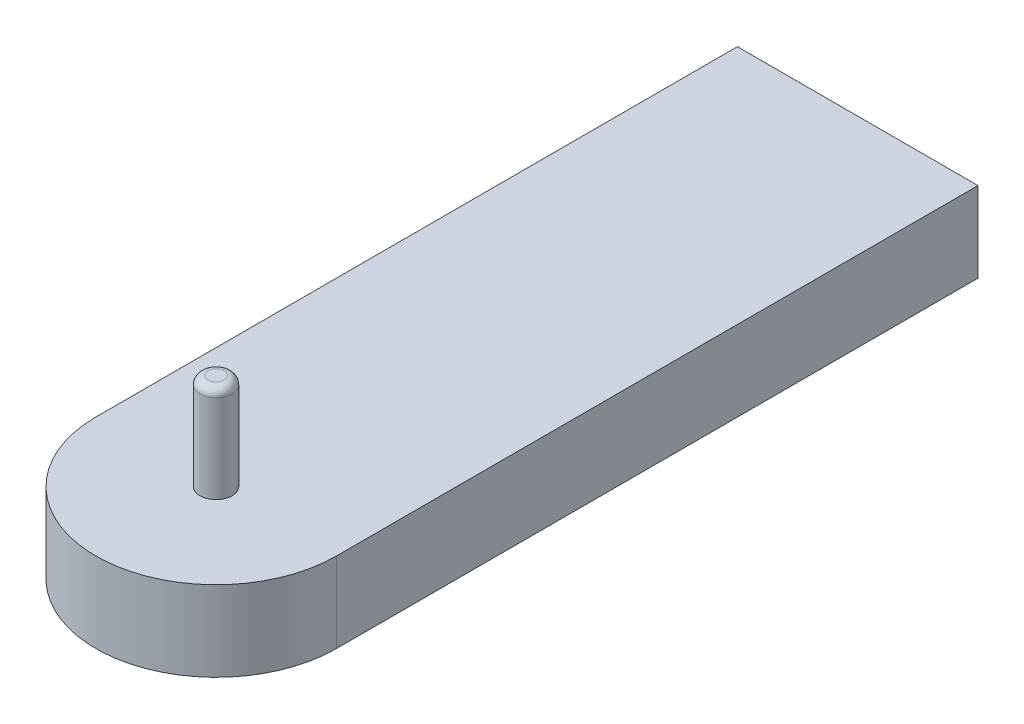
ISO-10303-21;
HEADER;
FILE_DESCRIPTION(('STEP AP214'),'2;1');
FILE_NAME('part.step','',(''),(''),'','','');
FILE_SCHEMA(('AUTOMOTIVE_DESIGN { 1 0 10303 214 1 1 1 1 }'));
ENDSEC;
DATA;
#1=APPLICATION_CONTEXT('core data for automotive mechanical design processes');
#2=APPLICATION_PROTOCOL_DEFINITION('international standard','automotive_design',2000,#1);
#3=PRODUCT_CONTEXT('',#1,'mechanical');
#4=PRODUCT('Part','Part','',(#3));
#5=PRODUCT_RELATED_PRODUCT_CATEGORY('part','',(#4));
#6=PRODUCT_DEFINITION_FORMATION('','',#4);
#7=PRODUCT_DEFINITION_CONTEXT('part definition',#1,'design');
#8=PRODUCT_DEFINITION('design','',#6,#7);
#9=PRODUCT_DEFINITION_SHAPE('','',#8);
#10=(LENGTH_UNIT() NAMED_UNIT(*) SI_UNIT(.MILLI.,.METRE.));
#11=(NAMED_UNIT(*) PLANE_ANGLE_UNIT() SI_UNIT($,.RADIAN.));
#12=(NAMED_UNIT(*) SI_UNIT($,.STERADIAN.) SOLID_ANGLE_UNIT());
#13=UNCERTAINTY_MEASURE_WITH_UNIT(LENGTH_MEASURE(1.E-05),#10,'distance_accuracy_value','');
#14=(GEOMETRIC_REPRESENTATION_CONTEXT(3) GLOBAL_UNCERTAINTY_ASSIGNED_CONTEXT((#13)) GLOBAL_UNIT_ASSIGNED_CONTEXT((#10,
#11,#12)) REPRESENTATION_CONTEXT('',''));
#15=CARTESIAN_POINT('',(0.,0.,0.));
#16=DIRECTION('',(0.,0.,1.));
#17=DIRECTION('',(1.,0.,0.));
#18=AXIS2_PLACEMENT_3D('',#15,#16,#17);
#19=CARTESIAN_POINT('',(75.0000000000001,50.,400.));
#20=DIRECTION('',(0.,1.,0.));
#21=DIRECTION('',(0.,0.,1.));
#22=AXIS2_PLACEMENT_3D('',#19,#20,#21);
#23=PLANE('',#22);
#24=DIRECTION('',(0.,0.,1.));
#25=VECTOR('',#24,1.);
#26=CARTESIAN_POINT('',(0.,50.,0.));
#27=LINE('',#26,#25);
#28=CARTESIAN_POINT('',(0.,50.,0.));
#29=VERTEX_POINT('',#28);
#30=CARTESIAN_POINT('',(0.,50.,400.));
#31=VERTEX_POINT('',#30);
#32=EDGE_CURVE('E89',#29,#31,#27,.T.);
#33=ORIENTED_EDGE('',*,*,#32,.T.);
#34=CARTESIAN_POINT('',(75.0000000000001,50.,400.));
#35=DIRECTION('',(0.,1.,0.));
#36=DIRECTION('',(0.,0.,1.));
#37=AXIS2_PLACEMENT_3D('',#34,#35,#36);
#38=CIRCLE('',#37,75.);
#39=CARTESIAN_POINT('',(150.,50.,400.));
#40=VERTEX_POINT('',#39);
#41=EDGE_CURVE('E84',#31,#40,#38,.T.);
#42=ORIENTED_EDGE('',*,*,#41,.T.);
#43=DIRECTION('',(0.,0.,-1.));
#44=VECTOR('',#43,1.);
#45=CARTESIAN_POINT('',(150.,50.,0.));
#46=LINE('',#45,#44);
#47=CARTESIAN_POINT('',(150.,50.,0.));
#48=VERTEX_POINT('',#47);
#49=EDGE_CURVE('E87',#40,#48,#46,.T.);
#50=ORIENTED_EDGE('',*,*,#49,.T.);
#51=DIRECTION('',(-1.,0.,0.));
#52=VECTOR('',#51,1.);
#53=CARTESIAN_POINT('',(0.,50.,0.));
#54=LINE('',#53,#52);
#55=EDGE_CURVE('E53',#48,#29,#54,.T.);
#56=ORIENTED_EDGE('',*,*,#55,.T.);
#57=EDGE_LOOP('',(#33,#42,#50,#56));
#58=FACE_BOUND('',#57,.T.);
#59=CARTESIAN_POINT('',(75.0000000000001,50.,400.));
#60=DIRECTION('',(0.,1.,0.));
#61=DIRECTION('',(0.,0.,1.));
#62=AXIS2_PLACEMENT_3D('',#59,#60,#61);
#63=CIRCLE('',#62,10.);
#64=CARTESIAN_POINT('',(75.0000000000001,50.,410.));
#65=VERTEX_POINT('',#64);
#66=EDGE_CURVE('E107',#65,#65,#63,.T.);
#67=ORIENTED_EDGE('',*,*,#66,.F.);
#68=EDGE_LOOP('',(#67));
#69=FACE_BOUND('',#68,.T.);
#70=ADVANCED_FACE('F36',(#58,#69),#23,.T.);
#71=CARTESIAN_POINT('',(0.,50.,0.));
#72=DIRECTION('',(1.,0.,0.));
#73=DIRECTION('',(0.,0.,-1.));
#74=AXIS2_PLACEMENT_3D('',#71,#72,#73);
#75=PLANE('',#74);
#76=DIRECTION('',(0.,0.,1.));
#77=VECTOR('',#76,1.);
#78=CARTESIAN_POINT('',(0.,0.,0.));
#79=LINE('',#78,#77);
#80=CARTESIAN_POINT('',(0.,0.,0.));
#81=VERTEX_POINT('',#80);
#82=CARTESIAN_POINT('',(0.,0.,400.));
#83=VERTEX_POINT('',#82);
#84=EDGE_CURVE('E104',#81,#83,#79,.T.);
#85=ORIENTED_EDGE('',*,*,#84,.T.);
#86=DIRECTION('',(0.,-1.,0.));
#87=VECTOR('',#86,1.);
#88=CARTESIAN_POINT('',(0.,50.,400.));
#89=LINE('',#88,#87);
#90=EDGE_CURVE('E95',#31,#83,#89,.T.);
#91=ORIENTED_EDGE('',*,*,#90,.F.);
#92=ORIENTED_EDGE('',*,*,#32,.F.);
#93=DIRECTION('',(0.,-1.,0.));
#94=VECTOR('',#93,1.);
#95=CARTESIAN_POINT('',(0.,50.,0.));
#96=LINE('',#95,#94);
#97=EDGE_CURVE('E100',#29,#81,#96,.T.);
#98=ORIENTED_EDGE('',*,*,#97,.T.);
#99=EDGE_LOOP('',(#85,#91,#92,#98));
#100=FACE_BOUND('',#99,.T.);
#101=ADVANCED_FACE('F127',(#100),#75,.F.);
#102=CARTESIAN_POINT('',(75.0000000000001,50.,400.));
#103=DIRECTION('',(0.,-1.,0.));
#104=DIRECTION('',(0.,0.,-1.));
#105=AXIS2_PLACEMENT_3D('',#102,#103,#104);
#106=CYLINDRICAL_SURFACE('',#105,75.);
#107=CARTESIAN_POINT('',(75.0000000000001,0.,400.));
#108=DIRECTION('',(0.,1.,0.));
#109=DIRECTION('',(0.,0.,1.));
#110=AXIS2_PLACEMENT_3D('',#107,#108,#109);
#111=CIRCLE('',#110,75.);
#112=CARTESIAN_POINT('',(150.,0.,400.));
#113=VERTEX_POINT('',#112);
#114=EDGE_CURVE('E94',#83,#113,#111,.T.);
#115=ORIENTED_EDGE('',*,*,#114,.T.);
#116=DIRECTION('',(0.,-1.,0.));
#117=VECTOR('',#116,1.);
#118=CARTESIAN_POINT('',(150.,50.,400.));
#119=LINE('',#118,#117);
#120=EDGE_CURVE('E92',#40,#113,#119,.T.);
#121=ORIENTED_EDGE('',*,*,#120,.F.);
#122=ORIENTED_EDGE('',*,*,#41,.F.);
#123=ORIENTED_EDGE('',*,*,#90,.T.);
#124=EDGE_LOOP('',(#115,#121,#122,#123));
#125=FACE_BOUND('',#124,.T.);
#126=ADVANCED_FACE('F93',(#125),#106,.T.);
#127=CARTESIAN_POINT('',(150.,50.,0.));
#128=DIRECTION('',(-1.,0.,0.));
#129=DIRECTION('',(0.,0.,1.));
#130=AXIS2_PLACEMENT_3D('',#127,#128,#129);
#131=PLANE('',#130);
#132=DIRECTION('',(0.,0.,-1.));
#133=VECTOR('',#132,1.);
#134=CARTESIAN_POINT('',(150.,0.,0.));
#135=LINE('',#134,#133);
#136=CARTESIAN_POINT('',(150.,0.,0.));
#137=VERTEX_POINT('',#136);
#138=EDGE_CURVE('E70',#113,#137,#135,.T.);
#139=ORIENTED_EDGE('',*,*,#138,.T.);
#140=DIRECTION('',(0.,-1.,0.));
#141=VECTOR('',#140,1.);
#142=CARTESIAN_POINT('',(150.,50.,0.));
#143=LINE('',#142,#141);
#144=EDGE_CURVE('E96',#48,#137,#143,.T.);
#145=ORIENTED_EDGE('',*,*,#144,.F.);
#146=ORIENTED_EDGE('',*,*,#49,.F.);
#147=ORIENTED_EDGE('',*,*,#120,.T.);
#148=EDGE_LOOP('',(#139,#145,#146,#147));
#149=FACE_BOUND('',#148,.T.);
#150=ADVANCED_FACE('F98',(#149),#131,.F.);
#151=CARTESIAN_POINT('',(0.,50.,0.));
#152=DIRECTION('',(0.,0.,1.));
#153=DIRECTION('',(1.,0.,0.));
#154=AXIS2_PLACEMENT_3D('',#151,#152,#153);
#155=PLANE('',#154);
#156=DIRECTION('',(-1.,0.,0.));
#157=VECTOR('',#156,1.);
#158=CARTESIAN_POINT('',(0.,0.,0.));
#159=LINE('',#158,#157);
#160=EDGE_CURVE('E76',#137,#81,#159,.T.);
#161=ORIENTED_EDGE('',*,*,#160,.T.);
#162=ORIENTED_EDGE('',*,*,#97,.F.);
#163=ORIENTED_EDGE('',*,*,#55,.F.);
#164=ORIENTED_EDGE('',*,*,#144,.T.);
#165=EDGE_LOOP('',(#161,#162,#163,#164));
#166=FACE_BOUND('',#165,.T.);
#167=ADVANCED_FACE('F138',(#166),#155,.F.);
#168=CARTESIAN_POINT('',(75.0000000000001,0.,400.));
#169=DIRECTION('',(0.,1.,0.));
#170=DIRECTION('',(0.,0.,1.));
#171=AXIS2_PLACEMENT_3D('',#168,#169,#170);
#172=PLANE('',#171);
#173=ORIENTED_EDGE('',*,*,#84,.F.);
#174=ORIENTED_EDGE('',*,*,#160,.F.);
#175=ORIENTED_EDGE('',*,*,#138,.F.);
#176=ORIENTED_EDGE('',*,*,#114,.F.);
#177=EDGE_LOOP('',(#173,#174,#175,#176));
#178=FACE_BOUND('',#177,.T.);
#179=ADVANCED_FACE('F135',(#178),#172,.F.);
#180=CARTESIAN_POINT('',(75.0000000000001,110.,400.));
#181=DIRECTION('',(0.,-1.,0.));
#182=DIRECTION('',(0.,0.,-1.));
#183=AXIS2_PLACEMENT_3D('',#180,#181,#182);
#184=CYLINDRICAL_SURFACE('',#183,10.);
#185=CARTESIAN_POINT('',(75.0000000000001,105.,400.));
#186=DIRECTION('',(0.,1.,0.));
#187=DIRECTION('',(0.,0.,1.));
#188=AXIS2_PLACEMENT_3D('',#185,#186,#187);
#189=CIRCLE('',#188,10.);
#190=CARTESIAN_POINT('',(75.0000000000001,105.,410.));
#191=VERTEX_POINT('',#190);
#192=EDGE_CURVE('E11',#191,#191,#189,.F.);
#193=ORIENTED_EDGE('',*,*,#192,.T.);
#194=EDGE_LOOP('',(#193));
#195=FACE_BOUND('',#194,.T.);
#196=ORIENTED_EDGE('',*,*,#66,.T.);
#197=EDGE_LOOP('',(#196));
#198=FACE_BOUND('',#197,.T.);
#199=ADVANCED_FACE('F123',(#195,#198),#184,.T.);
#200=CARTESIAN_POINT('',(75.0000000000001,110.,400.));
#201=DIRECTION('',(0.,1.,0.));
#202=DIRECTION('',(0.,0.,1.));
#203=AXIS2_PLACEMENT_3D('',#200,#201,#202);
#204=PLANE('',#203);
#205=CARTESIAN_POINT('',(75.0000000000001,110.,400.));
#206=DIRECTION('',(0.,1.,0.));
#207=DIRECTION('',(0.,0.,1.));
#208=AXIS2_PLACEMENT_3D('',#205,#206,#207);
#209=CIRCLE('',#208,5.);
#210=CARTESIAN_POINT('',(75.0000000000001,110.,405.));
#211=VERTEX_POINT('',#210);
#212=EDGE_CURVE('E45',#211,#211,#209,.T.);
#213=ORIENTED_EDGE('',*,*,#212,.T.);
#214=EDGE_LOOP('',(#213));
#215=FACE_BOUND('',#214,.T.);
#216=ADVANCED_FACE('F116',(#215),#204,.T.);
#217=CARTESIAN_POINT('',(75.0000000000001,105.,400.));
#218=DIRECTION('',(0.,1.,0.));
#219=DIRECTION('',(0.,0.,1.));
#220=AXIS2_PLACEMENT_3D('',#217,#218,#219);
#221=DEGENERATE_TOROIDAL_SURFACE('',#220,5.,5.,.T.);
#222=ORIENTED_EDGE('',*,*,#192,.F.);
#223=EDGE_LOOP('',(#222));
#224=FACE_BOUND('',#223,.T.);
#225=ORIENTED_EDGE('',*,*,#212,.F.);
#226=EDGE_LOOP('',(#225));
#227=FACE_BOUND('',#226,.T.);
#228=ADVANCED_FACE('F38',(#224,#227),#221,.T.);
#229=CLOSED_SHELL('',(#70,#101,#126,#150,#167,#179,#199,#216,#228));
#230=MANIFOLD_SOLID_BREP('B2',#229);
#231=ADVANCED_BREP_SHAPE_REPRESENTATION('',(#18,#230),#14);
#232=SHAPE_DEFINITION_REPRESENTATION(#9,#231);
ENDSEC;
END-ISO-10303-21;
